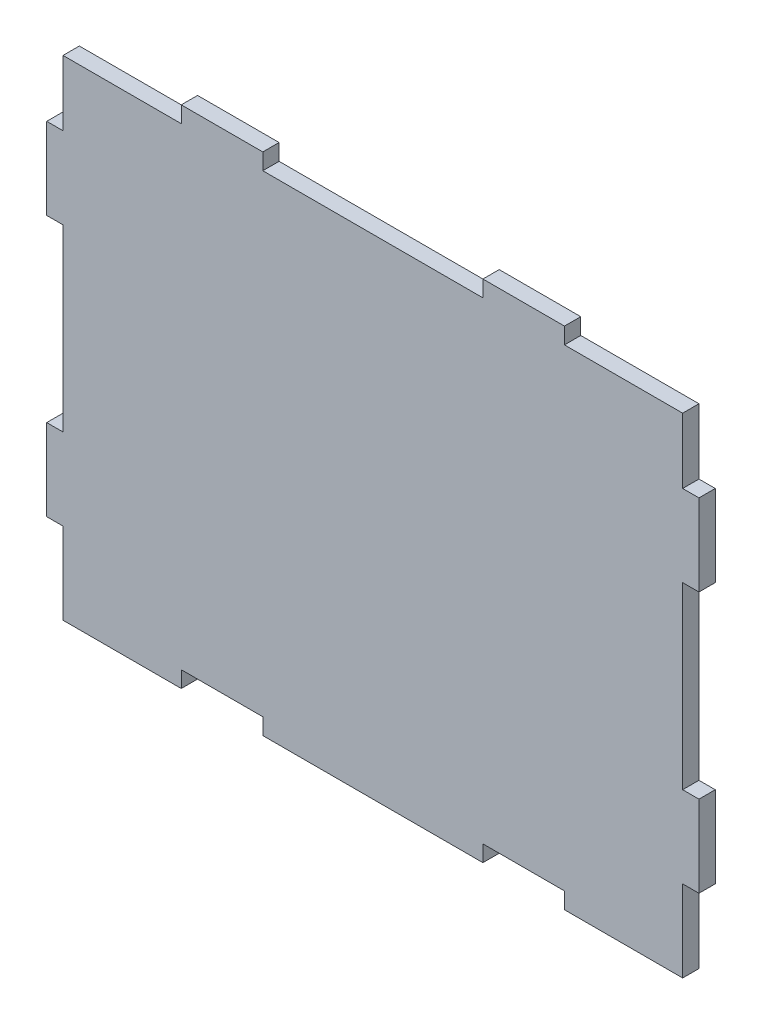
ISO-10303-21;
HEADER;
FILE_DESCRIPTION(('STEP AP214'),'2;1');
FILE_NAME('part.step','',(''),(''),'','','');
FILE_SCHEMA(('AUTOMOTIVE_DESIGN { 1 0 10303 214 1 1 1 1 }'));
ENDSEC;
DATA;
#1=APPLICATION_CONTEXT('core data for automotive mechanical design processes');
#2=APPLICATION_PROTOCOL_DEFINITION('international standard','automotive_design',2000,#1);
#3=PRODUCT_CONTEXT('',#1,'mechanical');
#4=PRODUCT('Part','Part','',(#3));
#5=PRODUCT_RELATED_PRODUCT_CATEGORY('part','',(#4));
#6=PRODUCT_DEFINITION_FORMATION('','',#4);
#7=PRODUCT_DEFINITION_CONTEXT('part definition',#1,'design');
#8=PRODUCT_DEFINITION('design','',#6,#7);
#9=PRODUCT_DEFINITION_SHAPE('','',#8);
#10=(LENGTH_UNIT() NAMED_UNIT(*) SI_UNIT(.MILLI.,.METRE.));
#11=(NAMED_UNIT(*) PLANE_ANGLE_UNIT() SI_UNIT($,.RADIAN.));
#12=(NAMED_UNIT(*) SI_UNIT($,.STERADIAN.) SOLID_ANGLE_UNIT());
#13=UNCERTAINTY_MEASURE_WITH_UNIT(LENGTH_MEASURE(1.E-05),#10,'distance_accuracy_value','');
#14=(GEOMETRIC_REPRESENTATION_CONTEXT(3) GLOBAL_UNCERTAINTY_ASSIGNED_CONTEXT((#13)) GLOBAL_UNIT_ASSIGNED_CONTEXT((#10,
#11,#12)) REPRESENTATION_CONTEXT('',''));
#15=CARTESIAN_POINT('',(0.,0.,0.));
#16=DIRECTION('',(0.,0.,1.));
#17=DIRECTION('',(1.,0.,0.));
#18=AXIS2_PLACEMENT_3D('',#15,#16,#17);
#19=CARTESIAN_POINT('',(-96.52,0.,5.08));
#20=DIRECTION('',(-1.,0.,0.));
#21=DIRECTION('',(0.,0.,1.));
#22=AXIS2_PLACEMENT_3D('',#19,#20,#21);
#23=PLANE('',#22);
#24=DIRECTION('',(0.,0.,1.));
#25=VECTOR('',#24,1.);
#26=CARTESIAN_POINT('',(-96.52,43.1799999999999,0.));
#27=LINE('',#26,#25);
#28=CARTESIAN_POINT('',(-96.52,43.1799999999999,0.));
#29=VERTEX_POINT('',#28);
#30=CARTESIAN_POINT('',(-96.52,43.1799999999999,5.08));
#31=VERTEX_POINT('',#30);
#32=EDGE_CURVE('E363',#29,#31,#27,.T.);
#33=ORIENTED_EDGE('',*,*,#32,.T.);
#34=DIRECTION('',(0.,1.,0.));
#35=VECTOR('',#34,1.);
#36=CARTESIAN_POINT('',(-96.52,0.,5.08));
#37=LINE('',#36,#35);
#38=CARTESIAN_POINT('',(-96.52,63.4999999999999,5.08));
#39=VERTEX_POINT('',#38);
#40=EDGE_CURVE('E485',#31,#39,#37,.T.);
#41=ORIENTED_EDGE('',*,*,#40,.T.);
#42=DIRECTION('',(0.,0.,-1.));
#43=VECTOR('',#42,1.);
#44=CARTESIAN_POINT('',(-96.52,63.4999999999999,5.08));
#45=LINE('',#44,#43);
#46=CARTESIAN_POINT('',(-96.52,63.4999999999999,0.));
#47=VERTEX_POINT('',#46);
#48=EDGE_CURVE('E542',#39,#47,#45,.T.);
#49=ORIENTED_EDGE('',*,*,#48,.T.);
#50=DIRECTION('',(0.,1.,0.));
#51=VECTOR('',#50,1.);
#52=CARTESIAN_POINT('',(-96.52,0.,0.));
#53=LINE('',#52,#51);
#54=EDGE_CURVE('E532',#29,#47,#53,.T.);
#55=ORIENTED_EDGE('',*,*,#54,.F.);
#56=EDGE_LOOP('',(#33,#41,#49,#55));
#57=FACE_BOUND('',#56,.T.);
#58=ADVANCED_FACE('F95',(#57),#23,.T.);
#59=DIRECTION('',(0.,0.,1.));
#60=VECTOR('',#59,1.);
#61=CARTESIAN_POINT('',(-96.52,17.78,0.));
#62=LINE('',#61,#60);
#63=CARTESIAN_POINT('',(-96.52,17.78,0.));
#64=VERTEX_POINT('',#63);
#65=CARTESIAN_POINT('',(-96.52,17.78,5.08));
#66=VERTEX_POINT('',#65);
#67=EDGE_CURVE('E340',#64,#66,#62,.T.);
#68=ORIENTED_EDGE('',*,*,#67,.F.);
#69=CARTESIAN_POINT('',(-96.52,-38.1,0.));
#70=VERTEX_POINT('',#69);
#71=EDGE_CURVE('E348',#70,#64,#53,.T.);
#72=ORIENTED_EDGE('',*,*,#71,.F.);
#73=DIRECTION('',(0.,0.,1.));
#74=VECTOR('',#73,1.);
#75=CARTESIAN_POINT('',(-96.52,-38.1,0.));
#76=LINE('',#75,#74);
#77=CARTESIAN_POINT('',(-96.52,-38.1,5.08));
#78=VERTEX_POINT('',#77);
#79=EDGE_CURVE('E385',#70,#78,#76,.T.);
#80=ORIENTED_EDGE('',*,*,#79,.T.);
#81=EDGE_CURVE('E484',#78,#66,#37,.T.);
#82=ORIENTED_EDGE('',*,*,#81,.T.);
#83=EDGE_LOOP('',(#68,#72,#80,#82));
#84=FACE_BOUND('',#83,.T.);
#85=ADVANCED_FACE('F730',(#84),#23,.T.);
#86=CARTESIAN_POINT('',(96.52,0.,5.08));
#87=DIRECTION('',(-1.,0.,0.));
#88=DIRECTION('',(0.,0.,1.));
#89=AXIS2_PLACEMENT_3D('',#86,#87,#88);
#90=PLANE('',#89);
#91=DIRECTION('',(0.,1.,0.));
#92=VECTOR('',#91,1.);
#93=CARTESIAN_POINT('',(96.52,0.,0.));
#94=LINE('',#93,#92);
#95=CARTESIAN_POINT('',(96.52,-38.1,0.));
#96=VERTEX_POINT('',#95);
#97=CARTESIAN_POINT('',(96.52,17.78,0.));
#98=VERTEX_POINT('',#97);
#99=EDGE_CURVE('E516',#96,#98,#94,.T.);
#100=ORIENTED_EDGE('',*,*,#99,.T.);
#101=DIRECTION('',(0.,0.,1.));
#102=VECTOR('',#101,1.);
#103=CARTESIAN_POINT('',(96.52,17.78,0.));
#104=LINE('',#103,#102);
#105=CARTESIAN_POINT('',(96.52,17.78,5.08));
#106=VERTEX_POINT('',#105);
#107=EDGE_CURVE('E411',#98,#106,#104,.T.);
#108=ORIENTED_EDGE('',*,*,#107,.T.);
#109=DIRECTION('',(0.,1.,0.));
#110=VECTOR('',#109,1.);
#111=CARTESIAN_POINT('',(96.52,0.,5.08));
#112=LINE('',#111,#110);
#113=CARTESIAN_POINT('',(96.52,-38.1,5.08));
#114=VERTEX_POINT('',#113);
#115=EDGE_CURVE('E469',#114,#106,#112,.T.);
#116=ORIENTED_EDGE('',*,*,#115,.F.);
#117=DIRECTION('',(0.,0.,1.));
#118=VECTOR('',#117,1.);
#119=CARTESIAN_POINT('',(96.52,-38.1,0.));
#120=LINE('',#119,#118);
#121=EDGE_CURVE('E440',#96,#114,#120,.T.);
#122=ORIENTED_EDGE('',*,*,#121,.F.);
#123=EDGE_LOOP('',(#100,#108,#116,#122));
#124=FACE_BOUND('',#123,.T.);
#125=ADVANCED_FACE('F659',(#124),#90,.F.);
#126=CARTESIAN_POINT('',(96.52,43.1799999999999,5.08));
#127=VERTEX_POINT('',#126);
#128=CARTESIAN_POINT('',(96.52,63.5,5.08));
#129=VERTEX_POINT('',#128);
#130=EDGE_CURVE('E464',#127,#129,#112,.T.);
#131=ORIENTED_EDGE('',*,*,#130,.F.);
#132=DIRECTION('',(0.,0.,1.));
#133=VECTOR('',#132,1.);
#134=CARTESIAN_POINT('',(96.52,43.1799999999999,0.));
#135=LINE('',#134,#133);
#136=CARTESIAN_POINT('',(96.52,43.1799999999999,0.));
#137=VERTEX_POINT('',#136);
#138=EDGE_CURVE('E413',#137,#127,#135,.T.);
#139=ORIENTED_EDGE('',*,*,#138,.F.);
#140=CARTESIAN_POINT('',(96.52,63.5,0.));
#141=VERTEX_POINT('',#140);
#142=EDGE_CURVE('E511',#137,#141,#94,.T.);
#143=ORIENTED_EDGE('',*,*,#142,.T.);
#144=DIRECTION('',(0.,0.,-1.));
#145=VECTOR('',#144,1.);
#146=CARTESIAN_POINT('',(96.52,63.5,5.08));
#147=LINE('',#146,#145);
#148=EDGE_CURVE('E555',#129,#141,#147,.T.);
#149=ORIENTED_EDGE('',*,*,#148,.F.);
#150=EDGE_LOOP('',(#131,#139,#143,#149));
#151=FACE_BOUND('',#150,.T.);
#152=ADVANCED_FACE('F643',(#151),#90,.F.);
#153=CARTESIAN_POINT('',(0.,63.5,5.08));
#154=DIRECTION('',(0.,-1.,0.));
#155=DIRECTION('',(1.,0.,0.));
#156=AXIS2_PLACEMENT_3D('',#153,#154,#155);
#157=PLANE('',#156);
#158=DIRECTION('',(0.,0.,-1.));
#159=VECTOR('',#158,1.);
#160=CARTESIAN_POINT('',(-34.29,63.5,5.08));
#161=LINE('',#160,#159);
#162=CARTESIAN_POINT('',(-34.29,63.5,5.08));
#163=VERTEX_POINT('',#162);
#164=CARTESIAN_POINT('',(-34.29,63.5,0.));
#165=VERTEX_POINT('',#164);
#166=EDGE_CURVE('E12',#163,#165,#161,.T.);
#167=ORIENTED_EDGE('',*,*,#166,.F.);
#168=DIRECTION('',(-1.,0.,0.));
#169=VECTOR('',#168,1.);
#170=CARTESIAN_POINT('',(0.,63.5,5.08));
#171=LINE('',#170,#169);
#172=CARTESIAN_POINT('',(34.29,63.5,5.08));
#173=VERTEX_POINT('',#172);
#174=EDGE_CURVE('E473',#173,#163,#171,.T.);
#175=ORIENTED_EDGE('',*,*,#174,.F.);
#176=DIRECTION('',(0.,0.,-1.));
#177=VECTOR('',#176,1.);
#178=CARTESIAN_POINT('',(34.29,63.5,5.08));
#179=LINE('',#178,#177);
#180=CARTESIAN_POINT('',(34.29,63.5,0.));
#181=VERTEX_POINT('',#180);
#182=EDGE_CURVE('E545',#173,#181,#179,.T.);
#183=ORIENTED_EDGE('',*,*,#182,.T.);
#184=DIRECTION('',(-1.,0.,0.));
#185=VECTOR('',#184,1.);
#186=CARTESIAN_POINT('',(0.,63.5,0.));
#187=LINE('',#186,#185);
#188=EDGE_CURVE('E520',#181,#165,#187,.T.);
#189=ORIENTED_EDGE('',*,*,#188,.T.);
#190=EDGE_LOOP('',(#167,#175,#183,#189));
#191=FACE_BOUND('',#190,.T.);
#192=ADVANCED_FACE('F603',(#191),#157,.F.);
#193=CARTESIAN_POINT('',(0.,-83.82,5.08));
#194=DIRECTION('',(0.,-1.,0.));
#195=DIRECTION('',(0.,0.,-1.));
#196=AXIS2_PLACEMENT_3D('',#193,#194,#195);
#197=PLANE('',#196);
#198=DIRECTION('',(-1.,0.,0.));
#199=VECTOR('',#198,1.);
#200=CARTESIAN_POINT('',(0.,-83.82,0.));
#201=LINE('',#200,#199);
#202=CARTESIAN_POINT('',(-34.29,-83.82,0.));
#203=VERTEX_POINT('',#202);
#204=CARTESIAN_POINT('',(-59.69,-83.82,0.));
#205=VERTEX_POINT('',#204);
#206=EDGE_CURVE('E491',#203,#205,#201,.T.);
#207=ORIENTED_EDGE('',*,*,#206,.F.);
#208=DIRECTION('',(0.,0.,-1.));
#209=VECTOR('',#208,1.);
#210=CARTESIAN_POINT('',(-34.29,-83.82,5.08));
#211=LINE('',#210,#209);
#212=CARTESIAN_POINT('',(-34.29,-83.82,5.08));
#213=VERTEX_POINT('',#212);
#214=EDGE_CURVE('E570',#213,#203,#211,.T.);
#215=ORIENTED_EDGE('',*,*,#214,.F.);
#216=DIRECTION('',(-1.,0.,0.));
#217=VECTOR('',#216,1.);
#218=CARTESIAN_POINT('',(0.,-83.82,5.08));
#219=LINE('',#218,#217);
#220=CARTESIAN_POINT('',(-59.69,-83.82,5.08));
#221=VERTEX_POINT('',#220);
#222=EDGE_CURVE('E443',#213,#221,#219,.T.);
#223=ORIENTED_EDGE('',*,*,#222,.T.);
#224=DIRECTION('',(0.,0.,-1.));
#225=VECTOR('',#224,1.);
#226=CARTESIAN_POINT('',(-59.69,-83.82,5.08));
#227=LINE('',#226,#225);
#228=EDGE_CURVE('E490',#221,#205,#227,.T.);
#229=ORIENTED_EDGE('',*,*,#228,.T.);
#230=EDGE_LOOP('',(#207,#215,#223,#229));
#231=FACE_BOUND('',#230,.T.);
#232=ADVANCED_FACE('F705',(#231),#197,.T.);
#233=CARTESIAN_POINT('',(-34.2899999999999,0.,5.08));
#234=DIRECTION('',(-1.,0.,0.));
#235=DIRECTION('',(0.,-1.,0.));
#236=AXIS2_PLACEMENT_3D('',#233,#234,#235);
#237=PLANE('',#236);
#238=DIRECTION('',(0.,1.,0.));
#239=VECTOR('',#238,1.);
#240=CARTESIAN_POINT('',(-34.2899999999999,0.,0.));
#241=LINE('',#240,#239);
#242=CARTESIAN_POINT('',(-34.29,-88.9,0.));
#243=VERTEX_POINT('',#242);
#244=EDGE_CURVE('E493',#243,#203,#241,.T.);
#245=ORIENTED_EDGE('',*,*,#244,.F.);
#246=DIRECTION('',(0.,0.,-1.));
#247=VECTOR('',#246,1.);
#248=CARTESIAN_POINT('',(-34.29,-88.9,5.08));
#249=LINE('',#248,#247);
#250=CARTESIAN_POINT('',(-34.29,-88.9,5.08));
#251=VERTEX_POINT('',#250);
#252=EDGE_CURVE('E568',#251,#243,#249,.T.);
#253=ORIENTED_EDGE('',*,*,#252,.F.);
#254=DIRECTION('',(0.,1.,0.));
#255=VECTOR('',#254,1.);
#256=CARTESIAN_POINT('',(-34.2899999999999,0.,5.08));
#257=LINE('',#256,#255);
#258=EDGE_CURVE('E446',#251,#213,#257,.T.);
#259=ORIENTED_EDGE('',*,*,#258,.T.);
#260=ORIENTED_EDGE('',*,*,#214,.T.);
#261=EDGE_LOOP('',(#245,#253,#259,#260));
#262=FACE_BOUND('',#261,.T.);
#263=ADVANCED_FACE('F700',(#262),#237,.T.);
#264=CARTESIAN_POINT('',(0.,-88.9,5.08));
#265=DIRECTION('',(0.,-1.,0.));
#266=DIRECTION('',(1.,0.,0.));
#267=AXIS2_PLACEMENT_3D('',#264,#265,#266);
#268=PLANE('',#267);
#269=DIRECTION('',(-1.,0.,0.));
#270=VECTOR('',#269,1.);
#271=CARTESIAN_POINT('',(0.,-88.9,0.));
#272=LINE('',#271,#270);
#273=CARTESIAN_POINT('',(34.29,-88.9,0.));
#274=VERTEX_POINT('',#273);
#275=EDGE_CURVE('E496',#274,#243,#272,.T.);
#276=ORIENTED_EDGE('',*,*,#275,.F.);
#277=DIRECTION('',(0.,0.,-1.));
#278=VECTOR('',#277,1.);
#279=CARTESIAN_POINT('',(34.29,-88.9,5.08));
#280=LINE('',#279,#278);
#281=CARTESIAN_POINT('',(34.29,-88.9,5.08));
#282=VERTEX_POINT('',#281);
#283=EDGE_CURVE('E566',#282,#274,#280,.T.);
#284=ORIENTED_EDGE('',*,*,#283,.F.);
#285=DIRECTION('',(-1.,0.,0.));
#286=VECTOR('',#285,1.);
#287=CARTESIAN_POINT('',(0.,-88.9,5.08));
#288=LINE('',#287,#286);
#289=EDGE_CURVE('E450',#282,#251,#288,.T.);
#290=ORIENTED_EDGE('',*,*,#289,.T.);
#291=ORIENTED_EDGE('',*,*,#252,.T.);
#292=EDGE_LOOP('',(#276,#284,#290,#291));
#293=FACE_BOUND('',#292,.T.);
#294=ADVANCED_FACE('F695',(#293),#268,.T.);
#295=CARTESIAN_POINT('',(34.29,0.,5.08));
#296=DIRECTION('',(-1.,0.,0.));
#297=DIRECTION('',(0.,0.,1.));
#298=AXIS2_PLACEMENT_3D('',#295,#296,#297);
#299=PLANE('',#298);
#300=DIRECTION('',(0.,1.,0.));
#301=VECTOR('',#300,1.);
#302=CARTESIAN_POINT('',(34.29,0.,0.));
#303=LINE('',#302,#301);
#304=CARTESIAN_POINT('',(34.29,-83.82,0.));
#305=VERTEX_POINT('',#304);
#306=EDGE_CURVE('E499',#274,#305,#303,.T.);
#307=ORIENTED_EDGE('',*,*,#306,.T.);
#308=DIRECTION('',(0.,0.,-1.));
#309=VECTOR('',#308,1.);
#310=CARTESIAN_POINT('',(34.29,-83.82,5.08));
#311=LINE('',#310,#309);
#312=CARTESIAN_POINT('',(34.29,-83.82,5.08));
#313=VERTEX_POINT('',#312);
#314=EDGE_CURVE('E564',#313,#305,#311,.T.);
#315=ORIENTED_EDGE('',*,*,#314,.F.);
#316=DIRECTION('',(0.,1.,0.));
#317=VECTOR('',#316,1.);
#318=CARTESIAN_POINT('',(34.29,0.,5.08));
#319=LINE('',#318,#317);
#320=EDGE_CURVE('E453',#282,#313,#319,.T.);
#321=ORIENTED_EDGE('',*,*,#320,.F.);
#322=ORIENTED_EDGE('',*,*,#283,.T.);
#323=EDGE_LOOP('',(#307,#315,#321,#322));
#324=FACE_BOUND('',#323,.T.);
#325=ADVANCED_FACE('F692',(#324),#299,.F.);
#326=CARTESIAN_POINT('',(0.,-83.82,5.08));
#327=DIRECTION('',(0.,-1.,0.));
#328=DIRECTION('',(1.,0.,0.));
#329=AXIS2_PLACEMENT_3D('',#326,#327,#328);
#330=PLANE('',#329);
#331=DIRECTION('',(-1.,0.,0.));
#332=VECTOR('',#331,1.);
#333=CARTESIAN_POINT('',(0.,-83.82,0.));
#334=LINE('',#333,#332);
#335=CARTESIAN_POINT('',(59.69,-83.82,0.));
#336=VERTEX_POINT('',#335);
#337=EDGE_CURVE('E502',#336,#305,#334,.T.);
#338=ORIENTED_EDGE('',*,*,#337,.F.);
#339=DIRECTION('',(0.,0.,-1.));
#340=VECTOR('',#339,1.);
#341=CARTESIAN_POINT('',(59.69,-83.82,5.08));
#342=LINE('',#341,#340);
#343=CARTESIAN_POINT('',(59.69,-83.82,5.08));
#344=VERTEX_POINT('',#343);
#345=EDGE_CURVE('E562',#344,#336,#342,.T.);
#346=ORIENTED_EDGE('',*,*,#345,.F.);
#347=DIRECTION('',(-1.,0.,0.));
#348=VECTOR('',#347,1.);
#349=CARTESIAN_POINT('',(0.,-83.82,5.08));
#350=LINE('',#349,#348);
#351=EDGE_CURVE('E455',#344,#313,#350,.T.);
#352=ORIENTED_EDGE('',*,*,#351,.T.);
#353=ORIENTED_EDGE('',*,*,#314,.T.);
#354=EDGE_LOOP('',(#338,#346,#352,#353));
#355=FACE_BOUND('',#354,.T.);
#356=ADVANCED_FACE('F688',(#355),#330,.T.);
#357=CARTESIAN_POINT('',(59.69,0.,5.08));
#358=DIRECTION('',(-1.,0.,0.));
#359=DIRECTION('',(0.,0.,1.));
#360=AXIS2_PLACEMENT_3D('',#357,#358,#359);
#361=PLANE('',#360);
#362=DIRECTION('',(0.,1.,0.));
#363=VECTOR('',#362,1.);
#364=CARTESIAN_POINT('',(59.69,0.,0.));
#365=LINE('',#364,#363);
#366=CARTESIAN_POINT('',(59.69,-88.9,0.));
#367=VERTEX_POINT('',#366);
#368=EDGE_CURVE('E505',#367,#336,#365,.T.);
#369=ORIENTED_EDGE('',*,*,#368,.F.);
#370=DIRECTION('',(0.,0.,-1.));
#371=VECTOR('',#370,1.);
#372=CARTESIAN_POINT('',(59.69,-88.9,5.08));
#373=LINE('',#372,#371);
#374=CARTESIAN_POINT('',(59.69,-88.9,5.08));
#375=VERTEX_POINT('',#374);
#376=EDGE_CURVE('E560',#375,#367,#373,.T.);
#377=ORIENTED_EDGE('',*,*,#376,.F.);
#378=DIRECTION('',(0.,1.,0.));
#379=VECTOR('',#378,1.);
#380=CARTESIAN_POINT('',(59.69,0.,5.08));
#381=LINE('',#380,#379);
#382=EDGE_CURVE('E458',#375,#344,#381,.T.);
#383=ORIENTED_EDGE('',*,*,#382,.T.);
#384=ORIENTED_EDGE('',*,*,#345,.T.);
#385=EDGE_LOOP('',(#369,#377,#383,#384));
#386=FACE_BOUND('',#385,.T.);
#387=ADVANCED_FACE('F684',(#386),#361,.T.);
#388=CARTESIAN_POINT('',(0.,-88.9,5.08));
#389=DIRECTION('',(0.,-1.,0.));
#390=DIRECTION('',(1.,0.,0.));
#391=AXIS2_PLACEMENT_3D('',#388,#389,#390);
#392=PLANE('',#391);
#393=DIRECTION('',(-1.,0.,0.));
#394=VECTOR('',#393,1.);
#395=CARTESIAN_POINT('',(0.,-88.9,0.));
#396=LINE('',#395,#394);
#397=CARTESIAN_POINT('',(96.52,-88.9,0.));
#398=VERTEX_POINT('',#397);
#399=EDGE_CURVE('E508',#398,#367,#396,.T.);
#400=ORIENTED_EDGE('',*,*,#399,.F.);
#401=DIRECTION('',(0.,0.,-1.));
#402=VECTOR('',#401,1.);
#403=CARTESIAN_POINT('',(96.52,-88.9,5.08));
#404=LINE('',#403,#402);
#405=CARTESIAN_POINT('',(96.52,-88.9,5.08));
#406=VERTEX_POINT('',#405);
#407=EDGE_CURVE('E558',#406,#398,#404,.T.);
#408=ORIENTED_EDGE('',*,*,#407,.F.);
#409=DIRECTION('',(-1.,0.,0.));
#410=VECTOR('',#409,1.);
#411=CARTESIAN_POINT('',(0.,-88.9,5.08));
#412=LINE('',#411,#410);
#413=EDGE_CURVE('E461',#406,#375,#412,.T.);
#414=ORIENTED_EDGE('',*,*,#413,.T.);
#415=ORIENTED_EDGE('',*,*,#376,.T.);
#416=EDGE_LOOP('',(#400,#408,#414,#415));
#417=FACE_BOUND('',#416,.T.);
#418=ADVANCED_FACE('F679',(#417),#392,.T.);
#419=CARTESIAN_POINT('',(96.52,-63.5,0.));
#420=VERTEX_POINT('',#419);
#421=EDGE_CURVE('E512',#398,#420,#94,.T.);
#422=ORIENTED_EDGE('',*,*,#421,.T.);
#423=DIRECTION('',(0.,0.,1.));
#424=VECTOR('',#423,1.);
#425=CARTESIAN_POINT('',(96.52,-63.5,0.));
#426=LINE('',#425,#424);
#427=CARTESIAN_POINT('',(96.52,-63.5,5.08));
#428=VERTEX_POINT('',#427);
#429=EDGE_CURVE('E437',#420,#428,#426,.T.);
#430=ORIENTED_EDGE('',*,*,#429,.T.);
#431=EDGE_CURVE('E465',#406,#428,#112,.T.);
#432=ORIENTED_EDGE('',*,*,#431,.F.);
#433=ORIENTED_EDGE('',*,*,#407,.T.);
#434=EDGE_LOOP('',(#422,#430,#432,#433));
#435=FACE_BOUND('',#434,.T.);
#436=ADVANCED_FACE('F675',(#435),#90,.F.);
#437=CARTESIAN_POINT('',(59.69,63.5,0.));
#438=VERTEX_POINT('',#437);
#439=EDGE_CURVE('E515',#141,#438,#187,.T.);
#440=ORIENTED_EDGE('',*,*,#439,.T.);
#441=DIRECTION('',(0.,0.,-1.));
#442=VECTOR('',#441,1.);
#443=CARTESIAN_POINT('',(59.69,63.5,5.08));
#444=LINE('',#443,#442);
#445=CARTESIAN_POINT('',(59.69,63.5,5.08));
#446=VERTEX_POINT('',#445);
#447=EDGE_CURVE('E552',#446,#438,#444,.T.);
#448=ORIENTED_EDGE('',*,*,#447,.F.);
#449=EDGE_CURVE('E468',#129,#446,#171,.T.);
#450=ORIENTED_EDGE('',*,*,#449,.F.);
#451=ORIENTED_EDGE('',*,*,#148,.T.);
#452=EDGE_LOOP('',(#440,#448,#450,#451));
#453=FACE_BOUND('',#452,.T.);
#454=ADVANCED_FACE('F637',(#453),#157,.F.);
#455=CARTESIAN_POINT('',(59.69,0.,5.08));
#456=DIRECTION('',(-1.,0.,0.));
#457=DIRECTION('',(0.,0.,1.));
#458=AXIS2_PLACEMENT_3D('',#455,#456,#457);
#459=PLANE('',#458);
#460=DIRECTION('',(0.,1.,0.));
#461=VECTOR('',#460,1.);
#462=CARTESIAN_POINT('',(59.69,0.,0.));
#463=LINE('',#462,#461);
#464=CARTESIAN_POINT('',(59.69,68.58,0.));
#465=VERTEX_POINT('',#464);
#466=EDGE_CURVE('E518',#438,#465,#463,.T.);
#467=ORIENTED_EDGE('',*,*,#466,.T.);
#468=DIRECTION('',(0.,0.,-1.));
#469=VECTOR('',#468,1.);
#470=CARTESIAN_POINT('',(59.69,68.58,5.08));
#471=LINE('',#470,#469);
#472=CARTESIAN_POINT('',(59.69,68.58,5.08));
#473=VERTEX_POINT('',#472);
#474=EDGE_CURVE('E549',#473,#465,#471,.T.);
#475=ORIENTED_EDGE('',*,*,#474,.F.);
#476=DIRECTION('',(0.,1.,0.));
#477=VECTOR('',#476,1.);
#478=CARTESIAN_POINT('',(59.69,0.,5.08));
#479=LINE('',#478,#477);
#480=EDGE_CURVE('E471',#446,#473,#479,.T.);
#481=ORIENTED_EDGE('',*,*,#480,.F.);
#482=ORIENTED_EDGE('',*,*,#447,.T.);
#483=EDGE_LOOP('',(#467,#475,#481,#482));
#484=FACE_BOUND('',#483,.T.);
#485=ADVANCED_FACE('F633',(#484),#459,.F.);
#486=CARTESIAN_POINT('',(0.,68.58,5.08));
#487=DIRECTION('',(0.,-1.,0.));
#488=DIRECTION('',(0.,0.,-1.));
#489=AXIS2_PLACEMENT_3D('',#486,#487,#488);
#490=PLANE('',#489);
#491=DIRECTION('',(-1.,0.,0.));
#492=VECTOR('',#491,1.);
#493=CARTESIAN_POINT('',(0.,68.58,0.));
#494=LINE('',#493,#492);
#495=CARTESIAN_POINT('',(34.29,68.58,0.));
#496=VERTEX_POINT('',#495);
#497=EDGE_CURVE('E522',#465,#496,#494,.T.);
#498=ORIENTED_EDGE('',*,*,#497,.T.);
#499=DIRECTION('',(0.,0.,-1.));
#500=VECTOR('',#499,1.);
#501=CARTESIAN_POINT('',(34.29,68.58,5.08));
#502=LINE('',#501,#500);
#503=CARTESIAN_POINT('',(34.29,68.58,5.08));
#504=VERTEX_POINT('',#503);
#505=EDGE_CURVE('E547',#504,#496,#502,.T.);
#506=ORIENTED_EDGE('',*,*,#505,.F.);
#507=DIRECTION('',(-1.,0.,0.));
#508=VECTOR('',#507,1.);
#509=CARTESIAN_POINT('',(0.,68.58,5.08));
#510=LINE('',#509,#508);
#511=EDGE_CURVE('E475',#473,#504,#510,.T.);
#512=ORIENTED_EDGE('',*,*,#511,.F.);
#513=ORIENTED_EDGE('',*,*,#474,.T.);
#514=EDGE_LOOP('',(#498,#506,#512,#513));
#515=FACE_BOUND('',#514,.T.);
#516=ADVANCED_FACE('F629',(#515),#490,.F.);
#517=CARTESIAN_POINT('',(34.29,0.,5.08));
#518=DIRECTION('',(-1.,0.,0.));
#519=DIRECTION('',(0.,0.,1.));
#520=AXIS2_PLACEMENT_3D('',#517,#518,#519);
#521=PLANE('',#520);
#522=DIRECTION('',(0.,1.,0.));
#523=VECTOR('',#522,1.);
#524=CARTESIAN_POINT('',(34.29,0.,0.));
#525=LINE('',#524,#523);
#526=EDGE_CURVE('E525',#181,#496,#525,.T.);
#527=ORIENTED_EDGE('',*,*,#526,.F.);
#528=ORIENTED_EDGE('',*,*,#182,.F.);
#529=DIRECTION('',(0.,1.,0.));
#530=VECTOR('',#529,1.);
#531=CARTESIAN_POINT('',(34.29,0.,5.08));
#532=LINE('',#531,#530);
#533=EDGE_CURVE('E477',#173,#504,#532,.T.);
#534=ORIENTED_EDGE('',*,*,#533,.T.);
#535=ORIENTED_EDGE('',*,*,#505,.T.);
#536=EDGE_LOOP('',(#527,#528,#534,#535));
#537=FACE_BOUND('',#536,.T.);
#538=ADVANCED_FACE('F624',(#537),#521,.T.);
#539=CARTESIAN_POINT('',(-59.69,63.4999999999999,5.08));
#540=VERTEX_POINT('',#539);
#541=EDGE_CURVE('E472',#540,#39,#171,.T.);
#542=ORIENTED_EDGE('',*,*,#541,.F.);
#543=DIRECTION('',(0.,0.,-1.));
#544=VECTOR('',#543,1.);
#545=CARTESIAN_POINT('',(-59.69,63.4999999999999,5.08));
#546=LINE('',#545,#544);
#547=CARTESIAN_POINT('',(-59.69,63.4999999999999,0.));
#548=VERTEX_POINT('',#547);
#549=EDGE_CURVE('E104',#540,#548,#546,.T.);
#550=ORIENTED_EDGE('',*,*,#549,.T.);
#551=EDGE_CURVE('E519',#548,#47,#187,.T.);
#552=ORIENTED_EDGE('',*,*,#551,.T.);
#553=ORIENTED_EDGE('',*,*,#48,.F.);
#554=EDGE_LOOP('',(#542,#550,#552,#553));
#555=FACE_BOUND('',#554,.T.);
#556=ADVANCED_FACE('F610',(#555),#157,.F.);
#557=DIRECTION('',(0.,0.,1.));
#558=VECTOR('',#557,1.);
#559=CARTESIAN_POINT('',(-96.52,-63.5,0.));
#560=LINE('',#559,#558);
#561=CARTESIAN_POINT('',(-96.52,-63.5,0.));
#562=VERTEX_POINT('',#561);
#563=CARTESIAN_POINT('',(-96.52,-63.5,5.08));
#564=VERTEX_POINT('',#563);
#565=EDGE_CURVE('E387',#562,#564,#560,.T.);
#566=ORIENTED_EDGE('',*,*,#565,.F.);
#567=CARTESIAN_POINT('',(-96.52,-88.9,0.));
#568=VERTEX_POINT('',#567);
#569=EDGE_CURVE('E528',#568,#562,#53,.T.);
#570=ORIENTED_EDGE('',*,*,#569,.F.);
#571=DIRECTION('',(0.,0.,-1.));
#572=VECTOR('',#571,1.);
#573=CARTESIAN_POINT('',(-96.52,-88.9,5.08));
#574=LINE('',#573,#572);
#575=CARTESIAN_POINT('',(-96.52,-88.9,5.08));
#576=VERTEX_POINT('',#575);
#577=EDGE_CURVE('E540',#576,#568,#574,.T.);
#578=ORIENTED_EDGE('',*,*,#577,.F.);
#579=EDGE_CURVE('E480',#576,#564,#37,.T.);
#580=ORIENTED_EDGE('',*,*,#579,.T.);
#581=EDGE_LOOP('',(#566,#570,#578,#580));
#582=FACE_BOUND('',#581,.T.);
#583=ADVANCED_FACE('F718',(#582),#23,.T.);
#584=CARTESIAN_POINT('',(0.,-88.9,5.08));
#585=DIRECTION('',(0.,-1.,0.));
#586=DIRECTION('',(1.,0.,0.));
#587=AXIS2_PLACEMENT_3D('',#584,#585,#586);
#588=PLANE('',#587);
#589=DIRECTION('',(-1.,0.,0.));
#590=VECTOR('',#589,1.);
#591=CARTESIAN_POINT('',(0.,-88.9,0.));
#592=LINE('',#591,#590);
#593=CARTESIAN_POINT('',(-59.69,-88.9,0.));
#594=VERTEX_POINT('',#593);
#595=EDGE_CURVE('E531',#594,#568,#592,.T.);
#596=ORIENTED_EDGE('',*,*,#595,.F.);
#597=DIRECTION('',(0.,0.,-1.));
#598=VECTOR('',#597,1.);
#599=CARTESIAN_POINT('',(-59.69,-88.9,5.08));
#600=LINE('',#599,#598);
#601=CARTESIAN_POINT('',(-59.69,-88.9,5.08));
#602=VERTEX_POINT('',#601);
#603=EDGE_CURVE('E538',#602,#594,#600,.T.);
#604=ORIENTED_EDGE('',*,*,#603,.F.);
#605=DIRECTION('',(-1.,0.,0.));
#606=VECTOR('',#605,1.);
#607=CARTESIAN_POINT('',(0.,-88.9,5.08));
#608=LINE('',#607,#606);
#609=EDGE_CURVE('E483',#602,#576,#608,.T.);
#610=ORIENTED_EDGE('',*,*,#609,.T.);
#611=ORIENTED_EDGE('',*,*,#577,.T.);
#612=EDGE_LOOP('',(#596,#604,#610,#611));
#613=FACE_BOUND('',#612,.T.);
#614=ADVANCED_FACE('F712',(#613),#588,.T.);
#615=CARTESIAN_POINT('',(-59.69,0.,5.08));
#616=DIRECTION('',(-1.,0.,0.));
#617=DIRECTION('',(0.,0.,1.));
#618=AXIS2_PLACEMENT_3D('',#615,#616,#617);
#619=PLANE('',#618);
#620=DIRECTION('',(0.,1.,0.));
#621=VECTOR('',#620,1.);
#622=CARTESIAN_POINT('',(-59.69,0.,0.));
#623=LINE('',#622,#621);
#624=EDGE_CURVE('E447',#594,#205,#623,.T.);
#625=ORIENTED_EDGE('',*,*,#624,.T.);
#626=ORIENTED_EDGE('',*,*,#228,.F.);
#627=DIRECTION('',(0.,1.,0.));
#628=VECTOR('',#627,1.);
#629=CARTESIAN_POINT('',(-59.69,0.,5.08));
#630=LINE('',#629,#628);
#631=EDGE_CURVE('E488',#602,#221,#630,.T.);
#632=ORIENTED_EDGE('',*,*,#631,.F.);
#633=ORIENTED_EDGE('',*,*,#603,.T.);
#634=EDGE_LOOP('',(#625,#626,#632,#633));
#635=FACE_BOUND('',#634,.T.);
#636=ADVANCED_FACE('F709',(#635),#619,.F.);
#637=CARTESIAN_POINT('',(0.,0.,5.08));
#638=DIRECTION('',(0.,0.,1.));
#639=DIRECTION('',(1.,0.,0.));
#640=AXIS2_PLACEMENT_3D('',#637,#638,#639);
#641=PLANE('',#640);
#642=ORIENTED_EDGE('',*,*,#222,.F.);
#643=ORIENTED_EDGE('',*,*,#258,.F.);
#644=ORIENTED_EDGE('',*,*,#289,.F.);
#645=ORIENTED_EDGE('',*,*,#320,.T.);
#646=ORIENTED_EDGE('',*,*,#351,.F.);
#647=ORIENTED_EDGE('',*,*,#382,.F.);
#648=ORIENTED_EDGE('',*,*,#413,.F.);
#649=ORIENTED_EDGE('',*,*,#431,.T.);
#650=DIRECTION('',(1.,0.,0.));
#651=VECTOR('',#650,1.);
#652=CARTESIAN_POINT('',(101.6,-63.5,5.08));
#653=LINE('',#652,#651);
#654=CARTESIAN_POINT('',(101.6,-63.5,5.08));
#655=VERTEX_POINT('',#654);
#656=EDGE_CURVE('E421',#428,#655,#653,.T.);
#657=ORIENTED_EDGE('',*,*,#656,.T.);
#658=DIRECTION('',(0.,1.,0.));
#659=VECTOR('',#658,1.);
#660=CARTESIAN_POINT('',(101.6,-63.5,5.08));
#661=LINE('',#660,#659);
#662=CARTESIAN_POINT('',(101.6,-38.1,5.08));
#663=VERTEX_POINT('',#662);
#664=EDGE_CURVE('E410',#655,#663,#661,.T.);
#665=ORIENTED_EDGE('',*,*,#664,.T.);
#666=DIRECTION('',(-1.,0.,0.));
#667=VECTOR('',#666,1.);
#668=CARTESIAN_POINT('',(101.6,-38.1,5.08));
#669=LINE('',#668,#667);
#670=EDGE_CURVE('E429',#663,#114,#669,.T.);
#671=ORIENTED_EDGE('',*,*,#670,.T.);
#672=ORIENTED_EDGE('',*,*,#115,.T.);
#673=DIRECTION('',(1.,0.,0.));
#674=VECTOR('',#673,1.);
#675=CARTESIAN_POINT('',(101.6,17.78,5.08));
#676=LINE('',#675,#674);
#677=CARTESIAN_POINT('',(101.6,17.78,5.08));
#678=VERTEX_POINT('',#677);
#679=EDGE_CURVE('E394',#106,#678,#676,.T.);
#680=ORIENTED_EDGE('',*,*,#679,.T.);
#681=DIRECTION('',(0.,1.,0.));
#682=VECTOR('',#681,1.);
#683=CARTESIAN_POINT('',(101.6,43.1799999999999,5.08));
#684=LINE('',#683,#682);
#685=CARTESIAN_POINT('',(101.6,43.1799999999999,5.08));
#686=VERTEX_POINT('',#685);
#687=EDGE_CURVE('E384',#678,#686,#684,.T.);
#688=ORIENTED_EDGE('',*,*,#687,.T.);
#689=DIRECTION('',(-1.,0.,0.));
#690=VECTOR('',#689,1.);
#691=CARTESIAN_POINT('',(101.6,43.1799999999999,5.08));
#692=LINE('',#691,#690);
#693=EDGE_CURVE('E403',#686,#127,#692,.T.);
#694=ORIENTED_EDGE('',*,*,#693,.T.);
#695=ORIENTED_EDGE('',*,*,#130,.T.);
#696=ORIENTED_EDGE('',*,*,#449,.T.);
#697=ORIENTED_EDGE('',*,*,#480,.T.);
#698=ORIENTED_EDGE('',*,*,#511,.T.);
#699=ORIENTED_EDGE('',*,*,#533,.F.);
#700=ORIENTED_EDGE('',*,*,#174,.T.);
#701=DIRECTION('',(0.,1.,0.));
#702=VECTOR('',#701,1.);
#703=CARTESIAN_POINT('',(-34.29,63.5,5.08));
#704=LINE('',#703,#702);
#705=CARTESIAN_POINT('',(-34.29,68.58,5.08));
#706=VERTEX_POINT('',#705);
#707=EDGE_CURVE('E573',#163,#706,#704,.T.);
#708=ORIENTED_EDGE('',*,*,#707,.T.);
#709=DIRECTION('',(-1.,0.,0.));
#710=VECTOR('',#709,1.);
#711=CARTESIAN_POINT('',(-34.29,68.58,5.08));
#712=LINE('',#711,#710);
#713=CARTESIAN_POINT('',(-59.69,68.58,5.08));
#714=VERTEX_POINT('',#713);
#715=EDGE_CURVE('E576',#706,#714,#712,.T.);
#716=ORIENTED_EDGE('',*,*,#715,.T.);
#717=DIRECTION('',(0.,1.,0.));
#718=VECTOR('',#717,1.);
#719=CARTESIAN_POINT('',(-59.69,63.5,5.08));
#720=LINE('',#719,#718);
#721=EDGE_CURVE('E579',#540,#714,#720,.T.);
#722=ORIENTED_EDGE('',*,*,#721,.F.);
#723=ORIENTED_EDGE('',*,*,#541,.T.);
#724=ORIENTED_EDGE('',*,*,#40,.F.);
#725=DIRECTION('',(-1.,0.,0.));
#726=VECTOR('',#725,1.);
#727=CARTESIAN_POINT('',(-101.6,43.1799999999999,5.08));
#728=LINE('',#727,#726);
#729=CARTESIAN_POINT('',(-101.6,43.1799999999999,5.08));
#730=VERTEX_POINT('',#729);
#731=EDGE_CURVE('E352',#31,#730,#728,.T.);
#732=ORIENTED_EDGE('',*,*,#731,.T.);
#733=DIRECTION('',(0.,-1.,0.));
#734=VECTOR('',#733,1.);
#735=CARTESIAN_POINT('',(-101.6,17.78,5.08));
#736=LINE('',#735,#734);
#737=CARTESIAN_POINT('',(-101.6,17.78,5.08));
#738=VERTEX_POINT('',#737);
#739=EDGE_CURVE('E358',#730,#738,#736,.T.);
#740=ORIENTED_EDGE('',*,*,#739,.T.);
#741=DIRECTION('',(1.,0.,0.));
#742=VECTOR('',#741,1.);
#743=CARTESIAN_POINT('',(-101.6,17.78,5.08));
#744=LINE('',#743,#742);
#745=EDGE_CURVE('E335',#738,#66,#744,.T.);
#746=ORIENTED_EDGE('',*,*,#745,.T.);
#747=ORIENTED_EDGE('',*,*,#81,.F.);
#748=DIRECTION('',(-1.,0.,0.));
#749=VECTOR('',#748,1.);
#750=CARTESIAN_POINT('',(-101.6,-38.1,5.08));
#751=LINE('',#750,#749);
#752=CARTESIAN_POINT('',(-101.6,-38.1,5.08));
#753=VERTEX_POINT('',#752);
#754=EDGE_CURVE('E120',#78,#753,#751,.T.);
#755=ORIENTED_EDGE('',*,*,#754,.T.);
#756=DIRECTION('',(0.,-1.,0.));
#757=VECTOR('',#756,1.);
#758=CARTESIAN_POINT('',(-101.6,-63.5,5.08));
#759=LINE('',#758,#757);
#760=CARTESIAN_POINT('',(-101.6,-63.5,5.08));
#761=VERTEX_POINT('',#760);
#762=EDGE_CURVE('E362',#753,#761,#759,.T.);
#763=ORIENTED_EDGE('',*,*,#762,.T.);
#764=DIRECTION('',(1.,0.,0.));
#765=VECTOR('',#764,1.);
#766=CARTESIAN_POINT('',(-101.6,-63.5,5.08));
#767=LINE('',#766,#765);
#768=EDGE_CURVE('E378',#761,#564,#767,.T.);
#769=ORIENTED_EDGE('',*,*,#768,.T.);
#770=ORIENTED_EDGE('',*,*,#579,.F.);
#771=ORIENTED_EDGE('',*,*,#609,.F.);
#772=ORIENTED_EDGE('',*,*,#631,.T.);
#773=EDGE_LOOP('',(#642,#643,#644,#645,#646,#647,#648,#649,#657,#665,#671,#672,#680,#688,#694,
#695,#696,#697,#698,#699,#700,#708,#716,#722,#723,#724,#732,#740,#746,#747,#755,#763,#769,#770,
#771,#772));
#774=FACE_BOUND('',#773,.T.);
#775=ADVANCED_FACE('F618',(#774),#641,.T.);
#776=CARTESIAN_POINT('',(0.,0.,0.));
#777=DIRECTION('',(0.,0.,1.));
#778=DIRECTION('',(1.,0.,0.));
#779=AXIS2_PLACEMENT_3D('',#776,#777,#778);
#780=PLANE('',#779);
#781=ORIENTED_EDGE('',*,*,#206,.T.);
#782=ORIENTED_EDGE('',*,*,#624,.F.);
#783=ORIENTED_EDGE('',*,*,#595,.T.);
#784=ORIENTED_EDGE('',*,*,#569,.T.);
#785=DIRECTION('',(1.,0.,0.));
#786=VECTOR('',#785,1.);
#787=CARTESIAN_POINT('',(-101.6,-63.5,0.));
#788=LINE('',#787,#786);
#789=CARTESIAN_POINT('',(-101.6,-63.5,0.));
#790=VERTEX_POINT('',#789);
#791=EDGE_CURVE('E370',#790,#562,#788,.T.);
#792=ORIENTED_EDGE('',*,*,#791,.F.);
#793=DIRECTION('',(0.,-1.,0.));
#794=VECTOR('',#793,1.);
#795=CARTESIAN_POINT('',(-101.6,-63.5,0.));
#796=LINE('',#795,#794);
#797=CARTESIAN_POINT('',(-101.6,-38.1,0.));
#798=VERTEX_POINT('',#797);
#799=EDGE_CURVE('E367',#798,#790,#796,.T.);
#800=ORIENTED_EDGE('',*,*,#799,.F.);
#801=DIRECTION('',(-1.,0.,0.));
#802=VECTOR('',#801,1.);
#803=CARTESIAN_POINT('',(-101.6,-38.1,0.));
#804=LINE('',#803,#802);
#805=EDGE_CURVE('E372',#70,#798,#804,.T.);
#806=ORIENTED_EDGE('',*,*,#805,.F.);
#807=ORIENTED_EDGE('',*,*,#71,.T.);
#808=DIRECTION('',(1.,0.,0.));
#809=VECTOR('',#808,1.);
#810=CARTESIAN_POINT('',(-101.6,17.78,0.));
#811=LINE('',#810,#809);
#812=CARTESIAN_POINT('',(-101.6,17.78,0.));
#813=VERTEX_POINT('',#812);
#814=EDGE_CURVE('E332',#813,#64,#811,.T.);
#815=ORIENTED_EDGE('',*,*,#814,.F.);
#816=DIRECTION('',(0.,-1.,0.));
#817=VECTOR('',#816,1.);
#818=CARTESIAN_POINT('',(-101.6,17.78,0.));
#819=LINE('',#818,#817);
#820=CARTESIAN_POINT('',(-101.6,43.1799999999999,0.));
#821=VERTEX_POINT('',#820);
#822=EDGE_CURVE('E345',#821,#813,#819,.T.);
#823=ORIENTED_EDGE('',*,*,#822,.F.);
#824=DIRECTION('',(-1.,0.,0.));
#825=VECTOR('',#824,1.);
#826=CARTESIAN_POINT('',(-101.6,43.1799999999999,0.));
#827=LINE('',#826,#825);
#828=EDGE_CURVE('E112',#29,#821,#827,.T.);
#829=ORIENTED_EDGE('',*,*,#828,.F.);
#830=ORIENTED_EDGE('',*,*,#54,.T.);
#831=ORIENTED_EDGE('',*,*,#551,.F.);
#832=DIRECTION('',(0.,1.,0.));
#833=VECTOR('',#832,1.);
#834=CARTESIAN_POINT('',(-59.69,63.5,0.));
#835=LINE('',#834,#833);
#836=CARTESIAN_POINT('',(-59.69,68.58,0.));
#837=VERTEX_POINT('',#836);
#838=EDGE_CURVE('E577',#548,#837,#835,.T.);
#839=ORIENTED_EDGE('',*,*,#838,.T.);
#840=DIRECTION('',(-1.,0.,0.));
#841=VECTOR('',#840,1.);
#842=CARTESIAN_POINT('',(-34.29,68.58,0.));
#843=LINE('',#842,#841);
#844=CARTESIAN_POINT('',(-34.29,68.58,0.));
#845=VERTEX_POINT('',#844);
#846=EDGE_CURVE('E585',#845,#837,#843,.T.);
#847=ORIENTED_EDGE('',*,*,#846,.F.);
#848=DIRECTION('',(0.,1.,0.));
#849=VECTOR('',#848,1.);
#850=CARTESIAN_POINT('',(-34.29,63.5,0.));
#851=LINE('',#850,#849);
#852=EDGE_CURVE('E436',#165,#845,#851,.T.);
#853=ORIENTED_EDGE('',*,*,#852,.F.);
#854=ORIENTED_EDGE('',*,*,#188,.F.);
#855=ORIENTED_EDGE('',*,*,#526,.T.);
#856=ORIENTED_EDGE('',*,*,#497,.F.);
#857=ORIENTED_EDGE('',*,*,#466,.F.);
#858=ORIENTED_EDGE('',*,*,#439,.F.);
#859=ORIENTED_EDGE('',*,*,#142,.F.);
#860=DIRECTION('',(-1.,0.,0.));
#861=VECTOR('',#860,1.);
#862=CARTESIAN_POINT('',(101.6,43.1799999999999,0.));
#863=LINE('',#862,#861);
#864=CARTESIAN_POINT('',(101.6,43.1799999999999,0.));
#865=VERTEX_POINT('',#864);
#866=EDGE_CURVE('E393',#865,#137,#863,.T.);
#867=ORIENTED_EDGE('',*,*,#866,.F.);
#868=DIRECTION('',(0.,1.,0.));
#869=VECTOR('',#868,1.);
#870=CARTESIAN_POINT('',(101.6,43.1799999999999,0.));
#871=LINE('',#870,#869);
#872=CARTESIAN_POINT('',(101.6,17.78,0.));
#873=VERTEX_POINT('',#872);
#874=EDGE_CURVE('E390',#873,#865,#871,.T.);
#875=ORIENTED_EDGE('',*,*,#874,.F.);
#876=DIRECTION('',(1.,0.,0.));
#877=VECTOR('',#876,1.);
#878=CARTESIAN_POINT('',(101.6,17.78,0.));
#879=LINE('',#878,#877);
#880=EDGE_CURVE('E397',#98,#873,#879,.T.);
#881=ORIENTED_EDGE('',*,*,#880,.F.);
#882=ORIENTED_EDGE('',*,*,#99,.F.);
#883=DIRECTION('',(-1.,0.,0.));
#884=VECTOR('',#883,1.);
#885=CARTESIAN_POINT('',(101.6,-38.1,0.));
#886=LINE('',#885,#884);
#887=CARTESIAN_POINT('',(101.6,-38.1,0.));
#888=VERTEX_POINT('',#887);
#889=EDGE_CURVE('E420',#888,#96,#886,.T.);
#890=ORIENTED_EDGE('',*,*,#889,.F.);
#891=DIRECTION('',(0.,1.,0.));
#892=VECTOR('',#891,1.);
#893=CARTESIAN_POINT('',(101.6,-63.5,0.));
#894=LINE('',#893,#892);
#895=CARTESIAN_POINT('',(101.6,-63.5,0.));
#896=VERTEX_POINT('',#895);
#897=EDGE_CURVE('E417',#896,#888,#894,.T.);
#898=ORIENTED_EDGE('',*,*,#897,.F.);
#899=DIRECTION('',(1.,0.,0.));
#900=VECTOR('',#899,1.);
#901=CARTESIAN_POINT('',(101.6,-63.5,0.));
#902=LINE('',#901,#900);
#903=EDGE_CURVE('E423',#420,#896,#902,.T.);
#904=ORIENTED_EDGE('',*,*,#903,.F.);
#905=ORIENTED_EDGE('',*,*,#421,.F.);
#906=ORIENTED_EDGE('',*,*,#399,.T.);
#907=ORIENTED_EDGE('',*,*,#368,.T.);
#908=ORIENTED_EDGE('',*,*,#337,.T.);
#909=ORIENTED_EDGE('',*,*,#306,.F.);
#910=ORIENTED_EDGE('',*,*,#275,.T.);
#911=ORIENTED_EDGE('',*,*,#244,.T.);
#912=EDGE_LOOP('',(#781,#782,#783,#784,#792,#800,#806,#807,#815,#823,#829,#830,#831,#839,#847,
#853,#854,#855,#856,#857,#858,#859,#867,#875,#881,#882,#890,#898,#904,#905,#906,#907,#908,#909,
#910,#911));
#913=FACE_BOUND('',#912,.T.);
#914=ADVANCED_FACE('F344',(#913),#780,.F.);
#915=CARTESIAN_POINT('',(-34.29,68.58,5.08));
#916=DIRECTION('',(0.,-1.,0.));
#917=DIRECTION('',(0.,0.,-1.));
#918=AXIS2_PLACEMENT_3D('',#915,#916,#917);
#919=PLANE('',#918);
#920=ORIENTED_EDGE('',*,*,#846,.T.);
#921=DIRECTION('',(0.,0.,-1.));
#922=VECTOR('',#921,1.);
#923=CARTESIAN_POINT('',(-59.69,68.58,5.08));
#924=LINE('',#923,#922);
#925=EDGE_CURVE('E582',#714,#837,#924,.T.);
#926=ORIENTED_EDGE('',*,*,#925,.F.);
#927=ORIENTED_EDGE('',*,*,#715,.F.);
#928=DIRECTION('',(0.,0.,-1.));
#929=VECTOR('',#928,1.);
#930=CARTESIAN_POINT('',(-34.29,68.58,5.08));
#931=LINE('',#930,#929);
#932=EDGE_CURVE('E99',#706,#845,#931,.T.);
#933=ORIENTED_EDGE('',*,*,#932,.T.);
#934=EDGE_LOOP('',(#920,#926,#927,#933));
#935=FACE_BOUND('',#934,.T.);
#936=ADVANCED_FACE('F595',(#935),#919,.F.);
#937=CARTESIAN_POINT('',(-59.69,63.5,5.08));
#938=DIRECTION('',(-1.,0.,0.));
#939=DIRECTION('',(0.,0.,1.));
#940=AXIS2_PLACEMENT_3D('',#937,#938,#939);
#941=PLANE('',#940);
#942=ORIENTED_EDGE('',*,*,#838,.F.);
#943=ORIENTED_EDGE('',*,*,#549,.F.);
#944=ORIENTED_EDGE('',*,*,#721,.T.);
#945=ORIENTED_EDGE('',*,*,#925,.T.);
#946=EDGE_LOOP('',(#942,#943,#944,#945));
#947=FACE_BOUND('',#946,.T.);
#948=ADVANCED_FACE('F758',(#947),#941,.T.);
#949=CARTESIAN_POINT('',(-34.29,63.5,5.08));
#950=DIRECTION('',(-1.,0.,0.));
#951=DIRECTION('',(0.,0.,1.));
#952=AXIS2_PLACEMENT_3D('',#949,#950,#951);
#953=PLANE('',#952);
#954=ORIENTED_EDGE('',*,*,#852,.T.);
#955=ORIENTED_EDGE('',*,*,#932,.F.);
#956=ORIENTED_EDGE('',*,*,#707,.F.);
#957=ORIENTED_EDGE('',*,*,#166,.T.);
#958=EDGE_LOOP('',(#954,#955,#956,#957));
#959=FACE_BOUND('',#958,.T.);
#960=ADVANCED_FACE('F97',(#959),#953,.F.);
#961=CARTESIAN_POINT('',(101.6,-63.5,0.));
#962=DIRECTION('',(1.,0.,0.));
#963=DIRECTION('',(0.,0.,-1.));
#964=AXIS2_PLACEMENT_3D('',#961,#962,#963);
#965=PLANE('',#964);
#966=ORIENTED_EDGE('',*,*,#664,.F.);
#967=DIRECTION('',(0.,0.,1.));
#968=VECTOR('',#967,1.);
#969=CARTESIAN_POINT('',(101.6,-63.5,0.));
#970=LINE('',#969,#968);
#971=EDGE_CURVE('E434',#896,#655,#970,.T.);
#972=ORIENTED_EDGE('',*,*,#971,.F.);
#973=ORIENTED_EDGE('',*,*,#897,.T.);
#974=DIRECTION('',(0.,0.,1.));
#975=VECTOR('',#974,1.);
#976=CARTESIAN_POINT('',(101.6,-38.1,0.));
#977=LINE('',#976,#975);
#978=EDGE_CURVE('E426',#888,#663,#977,.T.);
#979=ORIENTED_EDGE('',*,*,#978,.T.);
#980=EDGE_LOOP('',(#966,#972,#973,#979));
#981=FACE_BOUND('',#980,.T.);
#982=ADVANCED_FACE('F669',(#981),#965,.T.);
#983=CARTESIAN_POINT('',(101.6,-63.5,0.));
#984=DIRECTION('',(0.,-1.,0.));
#985=DIRECTION('',(0.,0.,-1.));
#986=AXIS2_PLACEMENT_3D('',#983,#984,#985);
#987=PLANE('',#986);
#988=ORIENTED_EDGE('',*,*,#656,.F.);
#989=ORIENTED_EDGE('',*,*,#429,.F.);
#990=ORIENTED_EDGE('',*,*,#903,.T.);
#991=ORIENTED_EDGE('',*,*,#971,.T.);
#992=EDGE_LOOP('',(#988,#989,#990,#991));
#993=FACE_BOUND('',#992,.T.);
#994=ADVANCED_FACE('F671',(#993),#987,.T.);
#995=CARTESIAN_POINT('',(101.6,-38.1,0.));
#996=DIRECTION('',(0.,1.,0.));
#997=DIRECTION('',(0.,0.,1.));
#998=AXIS2_PLACEMENT_3D('',#995,#996,#997);
#999=PLANE('',#998);
#1000=ORIENTED_EDGE('',*,*,#670,.F.);
#1001=ORIENTED_EDGE('',*,*,#978,.F.);
#1002=ORIENTED_EDGE('',*,*,#889,.T.);
#1003=ORIENTED_EDGE('',*,*,#121,.T.);
#1004=EDGE_LOOP('',(#1000,#1001,#1002,#1003));
#1005=FACE_BOUND('',#1004,.T.);
#1006=ADVANCED_FACE('F664',(#1005),#999,.T.);
#1007=CARTESIAN_POINT('',(101.6,43.1799999999999,0.));
#1008=DIRECTION('',(1.,0.,0.));
#1009=DIRECTION('',(0.,0.,-1.));
#1010=AXIS2_PLACEMENT_3D('',#1007,#1008,#1009);
#1011=PLANE('',#1010);
#1012=ORIENTED_EDGE('',*,*,#687,.F.);
#1013=DIRECTION('',(0.,0.,1.));
#1014=VECTOR('',#1013,1.);
#1015=CARTESIAN_POINT('',(101.6,17.78,0.));
#1016=LINE('',#1015,#1014);
#1017=EDGE_CURVE('E408',#873,#678,#1016,.T.);
#1018=ORIENTED_EDGE('',*,*,#1017,.F.);
#1019=ORIENTED_EDGE('',*,*,#874,.T.);
#1020=DIRECTION('',(0.,0.,1.));
#1021=VECTOR('',#1020,1.);
#1022=CARTESIAN_POINT('',(101.6,43.1799999999999,0.));
#1023=LINE('',#1022,#1021);
#1024=EDGE_CURVE('E400',#865,#686,#1023,.T.);
#1025=ORIENTED_EDGE('',*,*,#1024,.T.);
#1026=EDGE_LOOP('',(#1012,#1018,#1019,#1025));
#1027=FACE_BOUND('',#1026,.T.);
#1028=ADVANCED_FACE('F649',(#1027),#1011,.T.);
#1029=CARTESIAN_POINT('',(101.6,17.78,0.));
#1030=DIRECTION('',(0.,-1.,0.));
#1031=DIRECTION('',(1.,0.,0.));
#1032=AXIS2_PLACEMENT_3D('',#1029,#1030,#1031);
#1033=PLANE('',#1032);
#1034=ORIENTED_EDGE('',*,*,#679,.F.);
#1035=ORIENTED_EDGE('',*,*,#107,.F.);
#1036=ORIENTED_EDGE('',*,*,#880,.T.);
#1037=ORIENTED_EDGE('',*,*,#1017,.T.);
#1038=EDGE_LOOP('',(#1034,#1035,#1036,#1037));
#1039=FACE_BOUND('',#1038,.T.);
#1040=ADVANCED_FACE('F655',(#1039),#1033,.T.);
#1041=CARTESIAN_POINT('',(101.6,43.1799999999999,0.));
#1042=DIRECTION('',(0.,1.,0.));
#1043=DIRECTION('',(0.,0.,1.));
#1044=AXIS2_PLACEMENT_3D('',#1041,#1042,#1043);
#1045=PLANE('',#1044);
#1046=ORIENTED_EDGE('',*,*,#693,.F.);
#1047=ORIENTED_EDGE('',*,*,#1024,.F.);
#1048=ORIENTED_EDGE('',*,*,#866,.T.);
#1049=ORIENTED_EDGE('',*,*,#138,.T.);
#1050=EDGE_LOOP('',(#1046,#1047,#1048,#1049));
#1051=FACE_BOUND('',#1050,.T.);
#1052=ADVANCED_FACE('F646',(#1051),#1045,.T.);
#1053=CARTESIAN_POINT('',(-101.6,-63.5,0.));
#1054=DIRECTION('',(-1.,0.,0.));
#1055=DIRECTION('',(0.,0.,1.));
#1056=AXIS2_PLACEMENT_3D('',#1053,#1054,#1055);
#1057=PLANE('',#1056);
#1058=ORIENTED_EDGE('',*,*,#762,.F.);
#1059=DIRECTION('',(0.,0.,1.));
#1060=VECTOR('',#1059,1.);
#1061=CARTESIAN_POINT('',(-101.6,-38.1,0.));
#1062=LINE('',#1061,#1060);
#1063=EDGE_CURVE('E382',#798,#753,#1062,.T.);
#1064=ORIENTED_EDGE('',*,*,#1063,.F.);
#1065=ORIENTED_EDGE('',*,*,#799,.T.);
#1066=DIRECTION('',(0.,0.,1.));
#1067=VECTOR('',#1066,1.);
#1068=CARTESIAN_POINT('',(-101.6,-63.5,0.));
#1069=LINE('',#1068,#1067);
#1070=EDGE_CURVE('E375',#790,#761,#1069,.T.);
#1071=ORIENTED_EDGE('',*,*,#1070,.T.);
#1072=EDGE_LOOP('',(#1058,#1064,#1065,#1071));
#1073=FACE_BOUND('',#1072,.T.);
#1074=ADVANCED_FACE('F726',(#1073),#1057,.T.);
#1075=CARTESIAN_POINT('',(-101.6,-38.1,0.));
#1076=DIRECTION('',(0.,1.,0.));
#1077=DIRECTION('',(0.,0.,1.));
#1078=AXIS2_PLACEMENT_3D('',#1075,#1076,#1077);
#1079=PLANE('',#1078);
#1080=ORIENTED_EDGE('',*,*,#754,.F.);
#1081=ORIENTED_EDGE('',*,*,#79,.F.);
#1082=ORIENTED_EDGE('',*,*,#805,.T.);
#1083=ORIENTED_EDGE('',*,*,#1063,.T.);
#1084=EDGE_LOOP('',(#1080,#1081,#1082,#1083));
#1085=FACE_BOUND('',#1084,.T.);
#1086=ADVANCED_FACE('F727',(#1085),#1079,.T.);
#1087=CARTESIAN_POINT('',(-101.6,-63.5,0.));
#1088=DIRECTION('',(0.,-1.,0.));
#1089=DIRECTION('',(0.,0.,-1.));
#1090=AXIS2_PLACEMENT_3D('',#1087,#1088,#1089);
#1091=PLANE('',#1090);
#1092=ORIENTED_EDGE('',*,*,#768,.F.);
#1093=ORIENTED_EDGE('',*,*,#1070,.F.);
#1094=ORIENTED_EDGE('',*,*,#791,.T.);
#1095=ORIENTED_EDGE('',*,*,#565,.T.);
#1096=EDGE_LOOP('',(#1092,#1093,#1094,#1095));
#1097=FACE_BOUND('',#1096,.T.);
#1098=ADVANCED_FACE('F722',(#1097),#1091,.T.);
#1099=CARTESIAN_POINT('',(-101.6,17.78,0.));
#1100=DIRECTION('',(-1.,0.,0.));
#1101=DIRECTION('',(0.,0.,1.));
#1102=AXIS2_PLACEMENT_3D('',#1099,#1100,#1101);
#1103=PLANE('',#1102);
#1104=ORIENTED_EDGE('',*,*,#739,.F.);
#1105=DIRECTION('',(0.,0.,1.));
#1106=VECTOR('',#1105,1.);
#1107=CARTESIAN_POINT('',(-101.6,43.1799999999999,0.));
#1108=LINE('',#1107,#1106);
#1109=EDGE_CURVE('E351',#821,#730,#1108,.T.);
#1110=ORIENTED_EDGE('',*,*,#1109,.F.);
#1111=ORIENTED_EDGE('',*,*,#822,.T.);
#1112=DIRECTION('',(0.,0.,1.));
#1113=VECTOR('',#1112,1.);
#1114=CARTESIAN_POINT('',(-101.6,17.78,0.));
#1115=LINE('',#1114,#1113);
#1116=EDGE_CURVE('E329',#813,#738,#1115,.T.);
#1117=ORIENTED_EDGE('',*,*,#1116,.T.);
#1118=EDGE_LOOP('',(#1104,#1110,#1111,#1117));
#1119=FACE_BOUND('',#1118,.T.);
#1120=ADVANCED_FACE('F350',(#1119),#1103,.T.);
#1121=CARTESIAN_POINT('',(-101.6,43.1799999999999,0.));
#1122=DIRECTION('',(0.,1.,0.));
#1123=DIRECTION('',(0.,0.,1.));
#1124=AXIS2_PLACEMENT_3D('',#1121,#1122,#1123);
#1125=PLANE('',#1124);
#1126=ORIENTED_EDGE('',*,*,#731,.F.);
#1127=ORIENTED_EDGE('',*,*,#32,.F.);
#1128=ORIENTED_EDGE('',*,*,#828,.T.);
#1129=ORIENTED_EDGE('',*,*,#1109,.T.);
#1130=EDGE_LOOP('',(#1126,#1127,#1128,#1129));
#1131=FACE_BOUND('',#1130,.T.);
#1132=ADVANCED_FACE('F732',(#1131),#1125,.T.);
#1133=CARTESIAN_POINT('',(-101.6,17.78,0.));
#1134=DIRECTION('',(0.,-1.,0.));
#1135=DIRECTION('',(0.,0.,-1.));
#1136=AXIS2_PLACEMENT_3D('',#1133,#1134,#1135);
#1137=PLANE('',#1136);
#1138=ORIENTED_EDGE('',*,*,#745,.F.);
#1139=ORIENTED_EDGE('',*,*,#1116,.F.);
#1140=ORIENTED_EDGE('',*,*,#814,.T.);
#1141=ORIENTED_EDGE('',*,*,#67,.T.);
#1142=EDGE_LOOP('',(#1138,#1139,#1140,#1141));
#1143=FACE_BOUND('',#1142,.T.);
#1144=ADVANCED_FACE('F331',(#1143),#1137,.T.);
#1145=CLOSED_SHELL('',(#58,#85,#125,#152,#192,#232,#263,#294,#325,#356,#387,#418,#436,#454,#485,
#516,#538,#556,#583,#614,#636,#775,#914,#936,#948,#960,#982,#994,#1006,#1028,#1040,#1052,#1074,
#1086,#1098,#1120,#1132,#1144));
#1146=MANIFOLD_SOLID_BREP('B2',#1145);
#1147=ADVANCED_BREP_SHAPE_REPRESENTATION('',(#18,#1146),#14);
#1148=SHAPE_DEFINITION_REPRESENTATION(#9,#1147);
ENDSEC;
END-ISO-10303-21;
